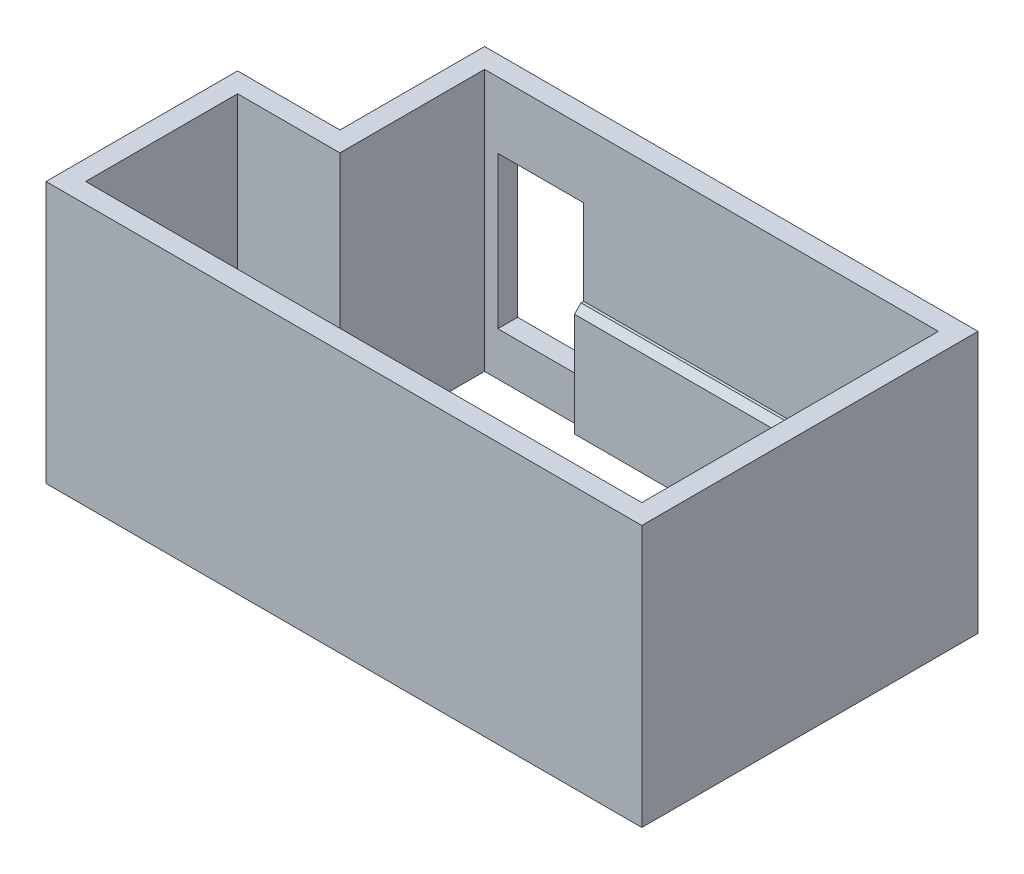
ISO-10303-21;
HEADER;
FILE_DESCRIPTION(('STEP AP214'),'2;1');
FILE_NAME('part.step','',(''),(''),'','','');
FILE_SCHEMA(('AUTOMOTIVE_DESIGN { 1 0 10303 214 1 1 1 1 }'));
ENDSEC;
DATA;
#1=APPLICATION_CONTEXT('core data for automotive mechanical design processes');
#2=APPLICATION_PROTOCOL_DEFINITION('international standard','automotive_design',2000,#1);
#3=PRODUCT_CONTEXT('',#1,'mechanical');
#4=PRODUCT('Part','Part','',(#3));
#5=PRODUCT_RELATED_PRODUCT_CATEGORY('part','',(#4));
#6=PRODUCT_DEFINITION_FORMATION('','',#4);
#7=PRODUCT_DEFINITION_CONTEXT('part definition',#1,'design');
#8=PRODUCT_DEFINITION('design','',#6,#7);
#9=PRODUCT_DEFINITION_SHAPE('','',#8);
#10=(LENGTH_UNIT() NAMED_UNIT(*) SI_UNIT(.MILLI.,.METRE.));
#11=(NAMED_UNIT(*) PLANE_ANGLE_UNIT() SI_UNIT($,.RADIAN.));
#12=(NAMED_UNIT(*) SI_UNIT($,.STERADIAN.) SOLID_ANGLE_UNIT());
#13=UNCERTAINTY_MEASURE_WITH_UNIT(LENGTH_MEASURE(1.E-05),#10,'distance_accuracy_value','');
#14=(GEOMETRIC_REPRESENTATION_CONTEXT(3) GLOBAL_UNCERTAINTY_ASSIGNED_CONTEXT((#13)) GLOBAL_UNIT_ASSIGNED_CONTEXT((#10,
#11,#12)) REPRESENTATION_CONTEXT('',''));
#15=CARTESIAN_POINT('',(0.,0.,0.));
#16=DIRECTION('',(0.,0.,1.));
#17=DIRECTION('',(1.,0.,0.));
#18=AXIS2_PLACEMENT_3D('',#15,#16,#17);
#19=CARTESIAN_POINT('',(7776.35402749019,1670.,-1789.28599467213));
#20=DIRECTION('',(0.,0.707106781186547,0.707106781186547));
#21=DIRECTION('',(-1.,0.,0.));
#22=AXIS2_PLACEMENT_3D('',#19,#20,#21);
#23=PLANE('',#22);
#24=DIRECTION('',(1.,0.,0.));
#25=VECTOR('',#24,1.);
#26=CARTESIAN_POINT('',(2406.3540274902,1670.,-1789.28599467213));
#27=LINE('',#26,#25);
#28=CARTESIAN_POINT('',(2406.3540274902,1670.,-1789.28599467213));
#29=VERTEX_POINT('',#28);
#30=CARTESIAN_POINT('',(7776.35402749019,1670.,-1789.28599467213));
#31=VERTEX_POINT('',#30);
#32=EDGE_CURVE('E234',#29,#31,#27,.T.);
#33=ORIENTED_EDGE('',*,*,#32,.F.);
#34=DIRECTION('',(0.,0.707106781186548,-0.707106781186548));
#35=VECTOR('',#34,1.);
#36=CARTESIAN_POINT('',(2406.35402749019,1670.,-1789.28599467213));
#37=LINE('',#36,#35);
#38=CARTESIAN_POINT('',(2406.3540274902,1570.,-1689.28599467213));
#39=VERTEX_POINT('',#38);
#40=EDGE_CURVE('E46',#39,#29,#37,.T.);
#41=ORIENTED_EDGE('',*,*,#40,.F.);
#42=DIRECTION('',(-1.,0.,0.));
#43=VECTOR('',#42,1.);
#44=CARTESIAN_POINT('',(2406.3540274902,1570.,-1689.28599467213));
#45=LINE('',#44,#43);
#46=CARTESIAN_POINT('',(7776.35402749019,1570.,-1689.28599467213));
#47=VERTEX_POINT('',#46);
#48=EDGE_CURVE('E252',#47,#39,#45,.T.);
#49=ORIENTED_EDGE('',*,*,#48,.F.);
#50=DIRECTION('',(0.,-0.707106781186548,0.707106781186548));
#51=VECTOR('',#50,1.);
#52=CARTESIAN_POINT('',(7776.35402749019,1920.35700266393,-2039.64299733607));
#53=LINE('',#52,#51);
#54=EDGE_CURVE('E13',#47,#31,#53,.F.);
#55=ORIENTED_EDGE('',*,*,#54,.T.);
#56=EDGE_LOOP('',(#33,#41,#49,#55));
#57=FACE_BOUND('',#56,.T.);
#58=ADVANCED_FACE('F39',(#57),#23,.T.);
#59=CARTESIAN_POINT('',(0.,3960.,-1829.28599467213));
#60=DIRECTION('',(0.,0.,-1.));
#61=DIRECTION('',(-1.,0.,0.));
#62=AXIS2_PLACEMENT_3D('',#59,#60,#61);
#63=PLANE('',#62);
#64=DIRECTION('',(-1.,0.,0.));
#65=VECTOR('',#64,1.);
#66=CARTESIAN_POINT('',(7776.35402749019,1670.,-1829.28599467213));
#67=LINE('',#66,#65);
#68=CARTESIAN_POINT('',(7776.35402749019,1670.,-1829.28599467213));
#69=VERTEX_POINT('',#68);
#70=CARTESIAN_POINT('',(2406.3540274902,1670.,-1829.28599467213));
#71=VERTEX_POINT('',#70);
#72=EDGE_CURVE('E261',#69,#71,#67,.T.);
#73=ORIENTED_EDGE('',*,*,#72,.F.);
#74=DIRECTION('',(0.,-1.,0.));
#75=VECTOR('',#74,1.);
#76=CARTESIAN_POINT('',(7776.35402749019,3960.,-1829.28599467213));
#77=LINE('',#76,#75);
#78=CARTESIAN_POINT('',(7776.35402749019,3960.,-1829.28599467213));
#79=VERTEX_POINT('',#78);
#80=EDGE_CURVE('E241',#79,#69,#77,.T.);
#81=ORIENTED_EDGE('',*,*,#80,.F.);
#82=DIRECTION('',(1.,0.,0.));
#83=VECTOR('',#82,1.);
#84=CARTESIAN_POINT('',(0.,3960.,-1829.28599467213));
#85=LINE('',#84,#83);
#86=CARTESIAN_POINT('',(906.354027490195,3960.,-1829.28599467213));
#87=VERTEX_POINT('',#86);
#88=EDGE_CURVE('E311',#87,#79,#85,.T.);
#89=ORIENTED_EDGE('',*,*,#88,.F.);
#90=DIRECTION('',(0.,-1.,0.));
#91=VECTOR('',#90,1.);
#92=CARTESIAN_POINT('',(906.354027490195,3960.,-1829.28599467213));
#93=LINE('',#92,#91);
#94=CARTESIAN_POINT('',(906.354027490195,0.,-1829.28599467213));
#95=VERTEX_POINT('',#94);
#96=EDGE_CURVE('E244',#87,#95,#93,.T.);
#97=ORIENTED_EDGE('',*,*,#96,.T.);
#98=DIRECTION('',(1.,0.,0.));
#99=VECTOR('',#98,1.);
#100=CARTESIAN_POINT('',(0.,0.,-1829.28599467213));
#101=LINE('',#100,#99);
#102=CARTESIAN_POINT('',(2406.3540274902,0.,-1829.28599467213));
#103=VERTEX_POINT('',#102);
#104=EDGE_CURVE('E194',#95,#103,#101,.T.);
#105=ORIENTED_EDGE('',*,*,#104,.T.);
#106=DIRECTION('',(0.,-1.,0.));
#107=VECTOR('',#106,1.);
#108=CARTESIAN_POINT('',(2406.3540274902,1670.,-1829.28599467213));
#109=LINE('',#108,#107);
#110=CARTESIAN_POINT('',(2406.3540274902,660.000000000001,-1829.28599467213));
#111=VERTEX_POINT('',#110);
#112=EDGE_CURVE('E182',#111,#103,#109,.T.);
#113=ORIENTED_EDGE('',*,*,#112,.F.);
#114=DIRECTION('',(1.,0.,0.));
#115=VECTOR('',#114,1.);
#116=CARTESIAN_POINT('',(1106.35402749019,660.,-1829.28599467213));
#117=LINE('',#116,#115);
#118=CARTESIAN_POINT('',(1106.35402749019,660.,-1829.28599467213));
#119=VERTEX_POINT('',#118);
#120=EDGE_CURVE('E286',#119,#111,#117,.T.);
#121=ORIENTED_EDGE('',*,*,#120,.F.);
#122=DIRECTION('',(0.,-1.,0.));
#123=VECTOR('',#122,1.);
#124=CARTESIAN_POINT('',(1106.35402749019,2960.,-1829.28599467213));
#125=LINE('',#124,#123);
#126=CARTESIAN_POINT('',(1106.35402749019,2960.,-1829.28599467213));
#127=VERTEX_POINT('',#126);
#128=EDGE_CURVE('E266',#127,#119,#125,.T.);
#129=ORIENTED_EDGE('',*,*,#128,.F.);
#130=DIRECTION('',(-1.,0.,0.));
#131=VECTOR('',#130,1.);
#132=CARTESIAN_POINT('',(1106.35402749019,2960.,-1829.28599467213));
#133=LINE('',#132,#131);
#134=CARTESIAN_POINT('',(2406.35402749019,2960.,-1829.28599467213));
#135=VERTEX_POINT('',#134);
#136=EDGE_CURVE('E275',#135,#127,#133,.T.);
#137=ORIENTED_EDGE('',*,*,#136,.F.);
#138=DIRECTION('',(0.,1.,0.));
#139=VECTOR('',#138,1.);
#140=CARTESIAN_POINT('',(2406.35402749019,2960.,-1829.28599467213));
#141=LINE('',#140,#139);
#142=EDGE_CURVE('E289',#71,#135,#141,.T.);
#143=ORIENTED_EDGE('',*,*,#142,.F.);
#144=EDGE_LOOP('',(#73,#81,#89,#97,#105,#113,#121,#129,#137,#143));
#145=FACE_BOUND('',#144,.T.);
#146=ADVANCED_FACE('F361',(#145),#63,.F.);
#147=CARTESIAN_POINT('',(7776.35402749019,3960.,0.));
#148=DIRECTION('',(1.,0.,0.));
#149=DIRECTION('',(0.,0.,-1.));
#150=AXIS2_PLACEMENT_3D('',#147,#148,#149);
#151=PLANE('',#150);
#152=DIRECTION('',(0.,0.,-1.));
#153=VECTOR('',#152,1.);
#154=CARTESIAN_POINT('',(7776.35402749019,1670.,-1689.28599467213));
#155=LINE('',#154,#153);
#156=EDGE_CURVE('E263',#31,#69,#155,.T.);
#157=ORIENTED_EDGE('',*,*,#156,.F.);
#158=ORIENTED_EDGE('',*,*,#54,.F.);
#159=DIRECTION('',(0.,1.,0.));
#160=VECTOR('',#159,1.);
#161=CARTESIAN_POINT('',(7776.35402749019,0.,-1689.28599467213));
#162=LINE('',#161,#160);
#163=CARTESIAN_POINT('',(7776.35402749019,0.,-1689.28599467213));
#164=VERTEX_POINT('',#163);
#165=EDGE_CURVE('E175',#164,#47,#162,.T.);
#166=ORIENTED_EDGE('',*,*,#165,.F.);
#167=DIRECTION('',(0.,0.,1.));
#168=VECTOR('',#167,1.);
#169=CARTESIAN_POINT('',(7776.35402749019,0.,0.));
#170=LINE('',#169,#168);
#171=CARTESIAN_POINT('',(7776.3540274902,0.,2660.71400532786));
#172=VERTEX_POINT('',#171);
#173=EDGE_CURVE('E186',#164,#172,#170,.T.);
#174=ORIENTED_EDGE('',*,*,#173,.T.);
#175=DIRECTION('',(0.,-1.,0.));
#176=VECTOR('',#175,1.);
#177=CARTESIAN_POINT('',(7776.3540274902,3960.,2660.71400532786));
#178=LINE('',#177,#176);
#179=CARTESIAN_POINT('',(7776.3540274902,3960.,2660.71400532786));
#180=VERTEX_POINT('',#179);
#181=EDGE_CURVE('E238',#180,#172,#178,.T.);
#182=ORIENTED_EDGE('',*,*,#181,.F.);
#183=DIRECTION('',(0.,0.,1.));
#184=VECTOR('',#183,1.);
#185=CARTESIAN_POINT('',(7776.35402749019,3960.,0.));
#186=LINE('',#185,#184);
#187=EDGE_CURVE('E313',#79,#180,#186,.T.);
#188=ORIENTED_EDGE('',*,*,#187,.F.);
#189=ORIENTED_EDGE('',*,*,#80,.T.);
#190=EDGE_LOOP('',(#157,#158,#166,#174,#182,#188,#189));
#191=FACE_BOUND('',#190,.T.);
#192=ADVANCED_FACE('F184',(#191),#151,.F.);
#193=CARTESIAN_POINT('',(-943.645972509804,3960.,0.));
#194=DIRECTION('',(-1.,0.,0.));
#195=DIRECTION('',(0.,0.,1.));
#196=AXIS2_PLACEMENT_3D('',#193,#194,#195);
#197=PLANE('',#196);
#198=DIRECTION('',(0.,0.,-1.));
#199=VECTOR('',#198,1.);
#200=CARTESIAN_POINT('',(-943.645972509804,0.,0.));
#201=LINE('',#200,#199);
#202=CARTESIAN_POINT('',(-943.645972509804,0.,2960.71400532786));
#203=VERTEX_POINT('',#202);
#204=CARTESIAN_POINT('',(-943.645972509804,0.,60.7140053278613));
#205=VERTEX_POINT('',#204);
#206=EDGE_CURVE('E196',#203,#205,#201,.T.);
#207=ORIENTED_EDGE('',*,*,#206,.F.);
#208=DIRECTION('',(0.,-1.,0.));
#209=VECTOR('',#208,1.);
#210=CARTESIAN_POINT('',(-943.645972509804,3960.,2960.71400532786));
#211=LINE('',#210,#209);
#212=CARTESIAN_POINT('',(-943.645972509804,3960.,2960.71400532786));
#213=VERTEX_POINT('',#212);
#214=EDGE_CURVE('E232',#213,#203,#211,.T.);
#215=ORIENTED_EDGE('',*,*,#214,.F.);
#216=DIRECTION('',(0.,0.,-1.));
#217=VECTOR('',#216,1.);
#218=CARTESIAN_POINT('',(-943.645972509804,3960.,0.));
#219=LINE('',#218,#217);
#220=CARTESIAN_POINT('',(-943.645972509804,3960.,60.7140053278613));
#221=VERTEX_POINT('',#220);
#222=EDGE_CURVE('E317',#213,#221,#219,.T.);
#223=ORIENTED_EDGE('',*,*,#222,.T.);
#224=DIRECTION('',(0.,-1.,0.));
#225=VECTOR('',#224,1.);
#226=CARTESIAN_POINT('',(-943.645972509804,3960.,60.7140053278613));
#227=LINE('',#226,#225);
#228=EDGE_CURVE('E221',#221,#205,#227,.T.);
#229=ORIENTED_EDGE('',*,*,#228,.T.);
#230=EDGE_LOOP('',(#207,#215,#223,#229));
#231=FACE_BOUND('',#230,.T.);
#232=ADVANCED_FACE('F404',(#231),#197,.T.);
#233=CARTESIAN_POINT('',(4.52346723584196E-13,3960.,2960.71400532786));
#234=DIRECTION('',(0.,0.,1.));
#235=DIRECTION('',(1.,0.,0.));
#236=AXIS2_PLACEMENT_3D('',#233,#234,#235);
#237=PLANE('',#236);
#238=DIRECTION('',(-1.,0.,0.));
#239=VECTOR('',#238,1.);
#240=CARTESIAN_POINT('',(4.52346723584196E-13,0.,2960.71400532786));
#241=LINE('',#240,#239);
#242=CARTESIAN_POINT('',(8076.3540274902,0.,2960.71400532786));
#243=VERTEX_POINT('',#242);
#244=EDGE_CURVE('E205',#243,#203,#241,.T.);
#245=ORIENTED_EDGE('',*,*,#244,.F.);
#246=DIRECTION('',(0.,-1.,0.));
#247=VECTOR('',#246,1.);
#248=CARTESIAN_POINT('',(8076.3540274902,3960.,2960.71400532786));
#249=LINE('',#248,#247);
#250=CARTESIAN_POINT('',(8076.3540274902,3960.,2960.71400532786));
#251=VERTEX_POINT('',#250);
#252=EDGE_CURVE('E230',#251,#243,#249,.T.);
#253=ORIENTED_EDGE('',*,*,#252,.F.);
#254=DIRECTION('',(-1.,0.,0.));
#255=VECTOR('',#254,1.);
#256=CARTESIAN_POINT('',(4.52346723584196E-13,3960.,2960.71400532786));
#257=LINE('',#256,#255);
#258=EDGE_CURVE('E320',#251,#213,#257,.T.);
#259=ORIENTED_EDGE('',*,*,#258,.T.);
#260=ORIENTED_EDGE('',*,*,#214,.T.);
#261=EDGE_LOOP('',(#245,#253,#259,#260));
#262=FACE_BOUND('',#261,.T.);
#263=ADVANCED_FACE('F399',(#262),#237,.T.);
#264=CARTESIAN_POINT('',(8076.3540274902,3960.,0.));
#265=DIRECTION('',(1.,0.,0.));
#266=DIRECTION('',(0.,0.,-1.));
#267=AXIS2_PLACEMENT_3D('',#264,#265,#266);
#268=PLANE('',#267);
#269=DIRECTION('',(0.,0.,1.));
#270=VECTOR('',#269,1.);
#271=CARTESIAN_POINT('',(8076.3540274902,0.,0.));
#272=LINE('',#271,#270);
#273=CARTESIAN_POINT('',(8076.3540274902,0.,-2129.28599467213));
#274=VERTEX_POINT('',#273);
#275=EDGE_CURVE('E208',#274,#243,#272,.T.);
#276=ORIENTED_EDGE('',*,*,#275,.F.);
#277=DIRECTION('',(0.,-1.,0.));
#278=VECTOR('',#277,1.);
#279=CARTESIAN_POINT('',(8076.3540274902,3960.,-2129.28599467213));
#280=LINE('',#279,#278);
#281=CARTESIAN_POINT('',(8076.3540274902,3960.,-2129.28599467213));
#282=VERTEX_POINT('',#281);
#283=EDGE_CURVE('E228',#282,#274,#280,.T.);
#284=ORIENTED_EDGE('',*,*,#283,.F.);
#285=DIRECTION('',(0.,0.,1.));
#286=VECTOR('',#285,1.);
#287=CARTESIAN_POINT('',(8076.3540274902,3960.,0.));
#288=LINE('',#287,#286);
#289=EDGE_CURVE('E323',#282,#251,#288,.T.);
#290=ORIENTED_EDGE('',*,*,#289,.T.);
#291=ORIENTED_EDGE('',*,*,#252,.T.);
#292=EDGE_LOOP('',(#276,#284,#290,#291));
#293=FACE_BOUND('',#292,.T.);
#294=ADVANCED_FACE('F382',(#293),#268,.T.);
#295=CARTESIAN_POINT('',(0.,3960.,-2129.28599467213));
#296=DIRECTION('',(0.,0.,-1.));
#297=DIRECTION('',(-1.,0.,0.));
#298=AXIS2_PLACEMENT_3D('',#295,#296,#297);
#299=PLANE('',#298);
#300=DIRECTION('',(0.,-1.,0.));
#301=VECTOR('',#300,1.);
#302=CARTESIAN_POINT('',(1106.35402749019,2960.,-2129.28599467213));
#303=LINE('',#302,#301);
#304=CARTESIAN_POINT('',(1106.35402749019,2960.,-2129.28599467213));
#305=VERTEX_POINT('',#304);
#306=CARTESIAN_POINT('',(1106.35402749019,660.,-2129.28599467213));
#307=VERTEX_POINT('',#306);
#308=EDGE_CURVE('E271',#305,#307,#303,.T.);
#309=ORIENTED_EDGE('',*,*,#308,.T.);
#310=DIRECTION('',(1.,0.,0.));
#311=VECTOR('',#310,1.);
#312=CARTESIAN_POINT('',(1106.35402749019,660.,-2129.28599467213));
#313=LINE('',#312,#311);
#314=CARTESIAN_POINT('',(2406.3540274902,660.,-2129.28599467213));
#315=VERTEX_POINT('',#314);
#316=EDGE_CURVE('E274',#307,#315,#313,.T.);
#317=ORIENTED_EDGE('',*,*,#316,.T.);
#318=DIRECTION('',(0.,1.,0.));
#319=VECTOR('',#318,1.);
#320=CARTESIAN_POINT('',(2406.35402749019,2960.,-2129.28599467213));
#321=LINE('',#320,#319);
#322=CARTESIAN_POINT('',(2406.35402749019,2960.,-2129.28599467213));
#323=VERTEX_POINT('',#322);
#324=EDGE_CURVE('E278',#315,#323,#321,.T.);
#325=ORIENTED_EDGE('',*,*,#324,.T.);
#326=DIRECTION('',(-1.,0.,0.));
#327=VECTOR('',#326,1.);
#328=CARTESIAN_POINT('',(1106.35402749019,2960.,-2129.28599467213));
#329=LINE('',#328,#327);
#330=EDGE_CURVE('E281',#323,#305,#329,.T.);
#331=ORIENTED_EDGE('',*,*,#330,.T.);
#332=EDGE_LOOP('',(#309,#317,#325,#331));
#333=FACE_BOUND('',#332,.T.);
#334=DIRECTION('',(1.,0.,0.));
#335=VECTOR('',#334,1.);
#336=CARTESIAN_POINT('',(0.,0.,-2129.28599467213));
#337=LINE('',#336,#335);
#338=CARTESIAN_POINT('',(606.354027490195,0.,-2129.28599467213));
#339=VERTEX_POINT('',#338);
#340=EDGE_CURVE('E211',#339,#274,#337,.T.);
#341=ORIENTED_EDGE('',*,*,#340,.F.);
#342=DIRECTION('',(0.,-1.,0.));
#343=VECTOR('',#342,1.);
#344=CARTESIAN_POINT('',(606.354027490195,3960.,-2129.28599467213));
#345=LINE('',#344,#343);
#346=CARTESIAN_POINT('',(606.354027490195,3960.,-2129.28599467213));
#347=VERTEX_POINT('',#346);
#348=EDGE_CURVE('E226',#347,#339,#345,.T.);
#349=ORIENTED_EDGE('',*,*,#348,.F.);
#350=DIRECTION('',(1.,0.,0.));
#351=VECTOR('',#350,1.);
#352=CARTESIAN_POINT('',(0.,3960.,-2129.28599467213));
#353=LINE('',#352,#351);
#354=EDGE_CURVE('E326',#347,#282,#353,.T.);
#355=ORIENTED_EDGE('',*,*,#354,.T.);
#356=ORIENTED_EDGE('',*,*,#283,.T.);
#357=EDGE_LOOP('',(#341,#349,#355,#356));
#358=FACE_BOUND('',#357,.T.);
#359=ADVANCED_FACE('F378',(#333,#358),#299,.T.);
#360=CARTESIAN_POINT('',(606.354027490195,3960.,0.));
#361=DIRECTION('',(1.,0.,0.));
#362=DIRECTION('',(0.,0.,-1.));
#363=AXIS2_PLACEMENT_3D('',#360,#361,#362);
#364=PLANE('',#363);
#365=DIRECTION('',(0.,0.,1.));
#366=VECTOR('',#365,1.);
#367=CARTESIAN_POINT('',(606.354027490195,0.,0.));
#368=LINE('',#367,#366);
#369=CARTESIAN_POINT('',(606.354027490195,0.,60.7140053278613));
#370=VERTEX_POINT('',#369);
#371=EDGE_CURVE('E214',#339,#370,#368,.T.);
#372=ORIENTED_EDGE('',*,*,#371,.T.);
#373=DIRECTION('',(0.,-1.,0.));
#374=VECTOR('',#373,1.);
#375=CARTESIAN_POINT('',(606.354027490195,3960.,60.7140053278613));
#376=LINE('',#375,#374);
#377=CARTESIAN_POINT('',(606.354027490195,3960.,60.7140053278613));
#378=VERTEX_POINT('',#377);
#379=EDGE_CURVE('E223',#378,#370,#376,.T.);
#380=ORIENTED_EDGE('',*,*,#379,.F.);
#381=DIRECTION('',(0.,0.,1.));
#382=VECTOR('',#381,1.);
#383=CARTESIAN_POINT('',(606.354027490195,3960.,0.));
#384=LINE('',#383,#382);
#385=EDGE_CURVE('E329',#347,#378,#384,.T.);
#386=ORIENTED_EDGE('',*,*,#385,.F.);
#387=ORIENTED_EDGE('',*,*,#348,.T.);
#388=EDGE_LOOP('',(#372,#380,#386,#387));
#389=FACE_BOUND('',#388,.T.);
#390=ADVANCED_FACE('F381',(#389),#364,.F.);
#391=CARTESIAN_POINT('',(-643.645972509803,3960.,0.));
#392=DIRECTION('',(-1.,0.,0.));
#393=DIRECTION('',(0.,0.,1.));
#394=AXIS2_PLACEMENT_3D('',#391,#392,#393);
#395=PLANE('',#394);
#396=DIRECTION('',(0.,0.,-1.));
#397=VECTOR('',#396,1.);
#398=CARTESIAN_POINT('',(-643.645972509803,0.,0.));
#399=LINE('',#398,#397);
#400=CARTESIAN_POINT('',(-643.645972509803,0.,2660.71400532786));
#401=VERTEX_POINT('',#400);
#402=CARTESIAN_POINT('',(-643.645972509804,0.,360.714005327861));
#403=VERTEX_POINT('',#402);
#404=EDGE_CURVE('E295',#401,#403,#399,.T.);
#405=ORIENTED_EDGE('',*,*,#404,.T.);
#406=DIRECTION('',(0.,-1.,0.));
#407=VECTOR('',#406,1.);
#408=CARTESIAN_POINT('',(-643.645972509804,3960.,360.714005327861));
#409=LINE('',#408,#407);
#410=CARTESIAN_POINT('',(-643.645972509804,3960.,360.714005327861));
#411=VERTEX_POINT('',#410);
#412=EDGE_CURVE('E224',#411,#403,#409,.T.);
#413=ORIENTED_EDGE('',*,*,#412,.F.);
#414=DIRECTION('',(0.,0.,-1.));
#415=VECTOR('',#414,1.);
#416=CARTESIAN_POINT('',(-643.645972509803,3960.,0.));
#417=LINE('',#416,#415);
#418=CARTESIAN_POINT('',(-643.645972509803,3960.,2660.71400532786));
#419=VERTEX_POINT('',#418);
#420=EDGE_CURVE('E220',#419,#411,#417,.T.);
#421=ORIENTED_EDGE('',*,*,#420,.F.);
#422=DIRECTION('',(0.,-1.,0.));
#423=VECTOR('',#422,1.);
#424=CARTESIAN_POINT('',(-643.645972509803,3960.,2660.71400532786));
#425=LINE('',#424,#423);
#426=EDGE_CURVE('E235',#419,#401,#425,.T.);
#427=ORIENTED_EDGE('',*,*,#426,.T.);
#428=EDGE_LOOP('',(#405,#413,#421,#427));
#429=FACE_BOUND('',#428,.T.);
#430=ADVANCED_FACE('F350',(#429),#395,.F.);
#431=CARTESIAN_POINT('',(0.,3960.,360.714005327861));
#432=DIRECTION('',(0.,0.,-1.));
#433=DIRECTION('',(-1.,0.,0.));
#434=AXIS2_PLACEMENT_3D('',#431,#432,#433);
#435=PLANE('',#434);
#436=DIRECTION('',(1.,0.,0.));
#437=VECTOR('',#436,1.);
#438=CARTESIAN_POINT('',(0.,0.,360.714005327861));
#439=LINE('',#438,#437);
#440=CARTESIAN_POINT('',(906.354027490196,0.,360.714005327861));
#441=VERTEX_POINT('',#440);
#442=EDGE_CURVE('E335',#403,#441,#439,.T.);
#443=ORIENTED_EDGE('',*,*,#442,.T.);
#444=DIRECTION('',(0.,-1.,0.));
#445=VECTOR('',#444,1.);
#446=CARTESIAN_POINT('',(906.354027490196,3960.,360.714005327861));
#447=LINE('',#446,#445);
#448=CARTESIAN_POINT('',(906.354027490196,3960.,360.714005327861));
#449=VERTEX_POINT('',#448);
#450=EDGE_CURVE('E246',#449,#441,#447,.T.);
#451=ORIENTED_EDGE('',*,*,#450,.F.);
#452=DIRECTION('',(1.,0.,0.));
#453=VECTOR('',#452,1.);
#454=CARTESIAN_POINT('',(0.,3960.,360.714005327861));
#455=LINE('',#454,#453);
#456=EDGE_CURVE('E306',#411,#449,#455,.T.);
#457=ORIENTED_EDGE('',*,*,#456,.F.);
#458=ORIENTED_EDGE('',*,*,#412,.T.);
#459=EDGE_LOOP('',(#443,#451,#457,#458));
#460=FACE_BOUND('',#459,.T.);
#461=ADVANCED_FACE('F346',(#460),#435,.F.);
#462=CARTESIAN_POINT('',(906.354027490196,3960.,-3.21634053354773E-13));
#463=DIRECTION('',(1.,0.,0.));
#464=DIRECTION('',(0.,0.,-1.));
#465=AXIS2_PLACEMENT_3D('',#462,#463,#464);
#466=PLANE('',#465);
#467=DIRECTION('',(0.,0.,1.));
#468=VECTOR('',#467,1.);
#469=CARTESIAN_POINT('',(906.354027490196,0.,-3.21634053354773E-13));
#470=LINE('',#469,#468);
#471=EDGE_CURVE('E199',#95,#441,#470,.T.);
#472=ORIENTED_EDGE('',*,*,#471,.F.);
#473=ORIENTED_EDGE('',*,*,#96,.F.);
#474=DIRECTION('',(0.,0.,1.));
#475=VECTOR('',#474,1.);
#476=CARTESIAN_POINT('',(906.354027490196,3960.,-3.21634053354773E-13));
#477=LINE('',#476,#475);
#478=EDGE_CURVE('E308',#87,#449,#477,.T.);
#479=ORIENTED_EDGE('',*,*,#478,.T.);
#480=ORIENTED_EDGE('',*,*,#450,.T.);
#481=EDGE_LOOP('',(#472,#473,#479,#480));
#482=FACE_BOUND('',#481,.T.);
#483=ADVANCED_FACE('F341',(#482),#466,.T.);
#484=CARTESIAN_POINT('',(0.,3960.,2660.71400532786));
#485=DIRECTION('',(0.,0.,1.));
#486=DIRECTION('',(1.,0.,0.));
#487=AXIS2_PLACEMENT_3D('',#484,#485,#486);
#488=PLANE('',#487);
#489=DIRECTION('',(-1.,0.,0.));
#490=VECTOR('',#489,1.);
#491=CARTESIAN_POINT('',(0.,0.,2660.71400532786));
#492=LINE('',#491,#490);
#493=EDGE_CURVE('E193',#172,#401,#492,.T.);
#494=ORIENTED_EDGE('',*,*,#493,.T.);
#495=ORIENTED_EDGE('',*,*,#426,.F.);
#496=DIRECTION('',(-1.,0.,0.));
#497=VECTOR('',#496,1.);
#498=CARTESIAN_POINT('',(0.,3960.,2660.71400532786));
#499=LINE('',#498,#497);
#500=EDGE_CURVE('E315',#180,#419,#499,.T.);
#501=ORIENTED_EDGE('',*,*,#500,.F.);
#502=ORIENTED_EDGE('',*,*,#181,.T.);
#503=EDGE_LOOP('',(#494,#495,#501,#502));
#504=FACE_BOUND('',#503,.T.);
#505=ADVANCED_FACE('F354',(#504),#488,.F.);
#506=CARTESIAN_POINT('',(0.,3960.,60.7140053278613));
#507=DIRECTION('',(0.,0.,-1.));
#508=DIRECTION('',(-1.,0.,0.));
#509=AXIS2_PLACEMENT_3D('',#506,#507,#508);
#510=PLANE('',#509);
#511=DIRECTION('',(1.,0.,0.));
#512=VECTOR('',#511,1.);
#513=CARTESIAN_POINT('',(0.,0.,60.7140053278613));
#514=LINE('',#513,#512);
#515=EDGE_CURVE('E217',#205,#370,#514,.T.);
#516=ORIENTED_EDGE('',*,*,#515,.F.);
#517=ORIENTED_EDGE('',*,*,#228,.F.);
#518=DIRECTION('',(1.,0.,0.));
#519=VECTOR('',#518,1.);
#520=CARTESIAN_POINT('',(0.,3960.,60.7140053278613));
#521=LINE('',#520,#519);
#522=EDGE_CURVE('E239',#221,#378,#521,.T.);
#523=ORIENTED_EDGE('',*,*,#522,.T.);
#524=ORIENTED_EDGE('',*,*,#379,.T.);
#525=EDGE_LOOP('',(#516,#517,#523,#524));
#526=FACE_BOUND('',#525,.T.);
#527=ADVANCED_FACE('F403',(#526),#510,.T.);
#528=CARTESIAN_POINT('',(0.,3960.,0.));
#529=DIRECTION('',(0.,1.,0.));
#530=DIRECTION('',(0.,0.,1.));
#531=AXIS2_PLACEMENT_3D('',#528,#529,#530);
#532=PLANE('',#531);
#533=ORIENTED_EDGE('',*,*,#420,.T.);
#534=ORIENTED_EDGE('',*,*,#456,.T.);
#535=ORIENTED_EDGE('',*,*,#478,.F.);
#536=ORIENTED_EDGE('',*,*,#88,.T.);
#537=ORIENTED_EDGE('',*,*,#187,.T.);
#538=ORIENTED_EDGE('',*,*,#500,.T.);
#539=EDGE_LOOP('',(#533,#534,#535,#536,#537,#538));
#540=FACE_BOUND('',#539,.T.);
#541=ORIENTED_EDGE('',*,*,#222,.F.);
#542=ORIENTED_EDGE('',*,*,#258,.F.);
#543=ORIENTED_EDGE('',*,*,#289,.F.);
#544=ORIENTED_EDGE('',*,*,#354,.F.);
#545=ORIENTED_EDGE('',*,*,#385,.T.);
#546=ORIENTED_EDGE('',*,*,#522,.F.);
#547=EDGE_LOOP('',(#541,#542,#543,#544,#545,#546));
#548=FACE_BOUND('',#547,.T.);
#549=ADVANCED_FACE('F358',(#540,#548),#532,.T.);
#550=CARTESIAN_POINT('',(0.,0.,0.));
#551=DIRECTION('',(0.,1.,0.));
#552=DIRECTION('',(0.,0.,1.));
#553=AXIS2_PLACEMENT_3D('',#550,#551,#552);
#554=PLANE('',#553);
#555=ORIENTED_EDGE('',*,*,#173,.F.);
#556=DIRECTION('',(1.,0.,0.));
#557=VECTOR('',#556,1.);
#558=CARTESIAN_POINT('',(2406.3540274902,0.,-1689.28599467213));
#559=LINE('',#558,#557);
#560=CARTESIAN_POINT('',(2406.3540274902,0.,-1689.28599467213));
#561=VERTEX_POINT('',#560);
#562=EDGE_CURVE('E173',#561,#164,#559,.T.);
#563=ORIENTED_EDGE('',*,*,#562,.F.);
#564=DIRECTION('',(0.,0.,-1.));
#565=VECTOR('',#564,1.);
#566=CARTESIAN_POINT('',(2406.3540274902,0.,-1689.28599467213));
#567=LINE('',#566,#565);
#568=EDGE_CURVE('E264',#561,#103,#567,.T.);
#569=ORIENTED_EDGE('',*,*,#568,.T.);
#570=ORIENTED_EDGE('',*,*,#104,.F.);
#571=ORIENTED_EDGE('',*,*,#471,.T.);
#572=ORIENTED_EDGE('',*,*,#442,.F.);
#573=ORIENTED_EDGE('',*,*,#404,.F.);
#574=ORIENTED_EDGE('',*,*,#493,.F.);
#575=EDGE_LOOP('',(#555,#563,#569,#570,#571,#572,#573,#574));
#576=FACE_BOUND('',#575,.T.);
#577=ORIENTED_EDGE('',*,*,#206,.T.);
#578=ORIENTED_EDGE('',*,*,#515,.T.);
#579=ORIENTED_EDGE('',*,*,#371,.F.);
#580=ORIENTED_EDGE('',*,*,#340,.T.);
#581=ORIENTED_EDGE('',*,*,#275,.T.);
#582=ORIENTED_EDGE('',*,*,#244,.T.);
#583=EDGE_LOOP('',(#577,#578,#579,#580,#581,#582));
#584=FACE_BOUND('',#583,.T.);
#585=ADVANCED_FACE('F190',(#576,#584),#554,.F.);
#586=CARTESIAN_POINT('',(1106.35402749019,2960.,-2129.28599467213));
#587=DIRECTION('',(-1.,0.,0.));
#588=DIRECTION('',(0.,-1.,0.));
#589=AXIS2_PLACEMENT_3D('',#586,#587,#588);
#590=PLANE('',#589);
#591=ORIENTED_EDGE('',*,*,#128,.T.);
#592=DIRECTION('',(0.,0.,1.));
#593=VECTOR('',#592,1.);
#594=CARTESIAN_POINT('',(1106.35402749019,660.,-2129.28599467213));
#595=LINE('',#594,#593);
#596=EDGE_CURVE('E284',#307,#119,#595,.T.);
#597=ORIENTED_EDGE('',*,*,#596,.F.);
#598=ORIENTED_EDGE('',*,*,#308,.F.);
#599=DIRECTION('',(0.,0.,1.));
#600=VECTOR('',#599,1.);
#601=CARTESIAN_POINT('',(1106.35402749019,2960.,-2129.28599467213));
#602=LINE('',#601,#600);
#603=EDGE_CURVE('E293',#305,#127,#602,.T.);
#604=ORIENTED_EDGE('',*,*,#603,.T.);
#605=EDGE_LOOP('',(#591,#597,#598,#604));
#606=FACE_BOUND('',#605,.T.);
#607=ADVANCED_FACE('F373',(#606),#590,.F.);
#608=CARTESIAN_POINT('',(1106.35402749019,2960.,-2129.28599467213));
#609=DIRECTION('',(0.,1.,0.));
#610=DIRECTION('',(0.,0.,1.));
#611=AXIS2_PLACEMENT_3D('',#608,#609,#610);
#612=PLANE('',#611);
#613=ORIENTED_EDGE('',*,*,#136,.T.);
#614=ORIENTED_EDGE('',*,*,#603,.F.);
#615=ORIENTED_EDGE('',*,*,#330,.F.);
#616=DIRECTION('',(0.,0.,1.));
#617=VECTOR('',#616,1.);
#618=CARTESIAN_POINT('',(2406.35402749019,2960.,-2129.28599467213));
#619=LINE('',#618,#617);
#620=EDGE_CURVE('E296',#323,#135,#619,.T.);
#621=ORIENTED_EDGE('',*,*,#620,.T.);
#622=EDGE_LOOP('',(#613,#614,#615,#621));
#623=FACE_BOUND('',#622,.T.);
#624=ADVANCED_FACE('F376',(#623),#612,.F.);
#625=CARTESIAN_POINT('',(2406.35402749019,2960.,-2129.28599467213));
#626=DIRECTION('',(1.,0.,0.));
#627=DIRECTION('',(0.,1.,0.));
#628=AXIS2_PLACEMENT_3D('',#625,#626,#627);
#629=PLANE('',#628);
#630=DIRECTION('',(0.,-1.,0.));
#631=VECTOR('',#630,1.);
#632=CARTESIAN_POINT('',(2406.3540274902,1670.,-1689.28599467213));
#633=LINE('',#632,#631);
#634=EDGE_CURVE('E177',#39,#561,#633,.T.);
#635=ORIENTED_EDGE('',*,*,#634,.F.);
#636=ORIENTED_EDGE('',*,*,#40,.T.);
#637=DIRECTION('',(0.,0.,-1.));
#638=VECTOR('',#637,1.);
#639=CARTESIAN_POINT('',(2406.3540274902,1670.,-1689.28599467213));
#640=LINE('',#639,#638);
#641=EDGE_CURVE('E256',#29,#71,#640,.T.);
#642=ORIENTED_EDGE('',*,*,#641,.T.);
#643=ORIENTED_EDGE('',*,*,#142,.T.);
#644=ORIENTED_EDGE('',*,*,#620,.F.);
#645=ORIENTED_EDGE('',*,*,#324,.F.);
#646=DIRECTION('',(0.,0.,1.));
#647=VECTOR('',#646,1.);
#648=CARTESIAN_POINT('',(2406.3540274902,660.000000000001,-2129.28599467213));
#649=LINE('',#648,#647);
#650=EDGE_CURVE('E299',#315,#111,#649,.T.);
#651=ORIENTED_EDGE('',*,*,#650,.T.);
#652=ORIENTED_EDGE('',*,*,#112,.T.);
#653=ORIENTED_EDGE('',*,*,#568,.F.);
#654=EDGE_LOOP('',(#635,#636,#642,#643,#644,#645,#651,#652,#653));
#655=FACE_BOUND('',#654,.T.);
#656=ADVANCED_FACE('F254',(#655),#629,.F.);
#657=CARTESIAN_POINT('',(1106.35402749019,660.,-2129.28599467213));
#658=DIRECTION('',(0.,-1.,0.));
#659=DIRECTION('',(1.,0.,0.));
#660=AXIS2_PLACEMENT_3D('',#657,#658,#659);
#661=PLANE('',#660);
#662=ORIENTED_EDGE('',*,*,#120,.T.);
#663=ORIENTED_EDGE('',*,*,#650,.F.);
#664=ORIENTED_EDGE('',*,*,#316,.F.);
#665=ORIENTED_EDGE('',*,*,#596,.T.);
#666=EDGE_LOOP('',(#662,#663,#664,#665));
#667=FACE_BOUND('',#666,.T.);
#668=ADVANCED_FACE('F369',(#667),#661,.F.);
#669=CARTESIAN_POINT('',(7776.35402749019,1670.,-1689.28599467213));
#670=DIRECTION('',(0.,-1.,0.));
#671=DIRECTION('',(0.,0.,-1.));
#672=AXIS2_PLACEMENT_3D('',#669,#670,#671);
#673=PLANE('',#672);
#674=ORIENTED_EDGE('',*,*,#641,.F.);
#675=ORIENTED_EDGE('',*,*,#32,.T.);
#676=ORIENTED_EDGE('',*,*,#156,.T.);
#677=ORIENTED_EDGE('',*,*,#72,.T.);
#678=EDGE_LOOP('',(#674,#675,#676,#677));
#679=FACE_BOUND('',#678,.T.);
#680=ADVANCED_FACE('F259',(#679),#673,.F.);
#681=CARTESIAN_POINT('',(0.,0.,-1689.28599467213));
#682=DIRECTION('',(0.,0.,1.));
#683=DIRECTION('',(1.,0.,0.));
#684=AXIS2_PLACEMENT_3D('',#681,#682,#683);
#685=PLANE('',#684);
#686=ORIENTED_EDGE('',*,*,#165,.T.);
#687=ORIENTED_EDGE('',*,*,#48,.T.);
#688=ORIENTED_EDGE('',*,*,#634,.T.);
#689=ORIENTED_EDGE('',*,*,#562,.T.);
#690=EDGE_LOOP('',(#686,#687,#688,#689));
#691=FACE_BOUND('',#690,.T.);
#692=ADVANCED_FACE('F174',(#691),#685,.T.);
#693=CLOSED_SHELL('',(#58,#146,#192,#232,#263,#294,#359,#390,#430,#461,#483,#505,#527,#549,#585,
#607,#624,#656,#668,#680,#692));
#694=MANIFOLD_SOLID_BREP('B2',#693);
#695=ADVANCED_BREP_SHAPE_REPRESENTATION('',(#18,#694),#14);
#696=SHAPE_DEFINITION_REPRESENTATION(#9,#695);
ENDSEC;
END-ISO-10303-21;
